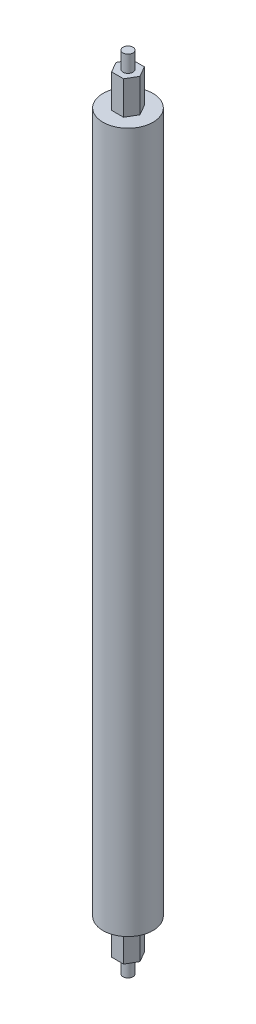
ISO-10303-21;
HEADER;
FILE_DESCRIPTION(('STEP AP214'),'2;1');
FILE_NAME('part.step','',(''),(''),'','','');
FILE_SCHEMA(('AUTOMOTIVE_DESIGN { 1 0 10303 214 1 1 1 1 }'));
ENDSEC;
DATA;
#1=APPLICATION_CONTEXT('core data for automotive mechanical design processes');
#2=APPLICATION_PROTOCOL_DEFINITION('international standard','automotive_design',2000,#1);
#3=PRODUCT_CONTEXT('',#1,'mechanical');
#4=PRODUCT('Part','Part','',(#3));
#5=PRODUCT_RELATED_PRODUCT_CATEGORY('part','',(#4));
#6=PRODUCT_DEFINITION_FORMATION('','',#4);
#7=PRODUCT_DEFINITION_CONTEXT('part definition',#1,'design');
#8=PRODUCT_DEFINITION('design','',#6,#7);
#9=PRODUCT_DEFINITION_SHAPE('','',#8);
#10=(LENGTH_UNIT() NAMED_UNIT(*) SI_UNIT(.MILLI.,.METRE.));
#11=(NAMED_UNIT(*) PLANE_ANGLE_UNIT() SI_UNIT($,.RADIAN.));
#12=(NAMED_UNIT(*) SI_UNIT($,.STERADIAN.) SOLID_ANGLE_UNIT());
#13=UNCERTAINTY_MEASURE_WITH_UNIT(LENGTH_MEASURE(1.E-05),#10,'distance_accuracy_value','');
#14=(GEOMETRIC_REPRESENTATION_CONTEXT(3) GLOBAL_UNCERTAINTY_ASSIGNED_CONTEXT((#13)) GLOBAL_UNIT_ASSIGNED_CONTEXT((#10,
#11,#12)) REPRESENTATION_CONTEXT('',''));
#15=CARTESIAN_POINT('',(0.,0.,0.));
#16=DIRECTION('',(0.,0.,1.));
#17=DIRECTION('',(1.,0.,0.));
#18=AXIS2_PLACEMENT_3D('',#15,#16,#17);
#19=CARTESIAN_POINT('',(0.,240.,0.));
#20=DIRECTION('',(0.,-1.,0.));
#21=DIRECTION('',(0.,0.,-1.));
#22=AXIS2_PLACEMENT_3D('',#19,#20,#21);
#23=CYLINDRICAL_SURFACE('',#22,7.5);
#24=CARTESIAN_POINT('',(0.,225.,0.));
#25=DIRECTION('',(0.,1.,0.));
#26=DIRECTION('',(0.,0.,1.));
#27=AXIS2_PLACEMENT_3D('',#24,#25,#26);
#28=CIRCLE('',#27,7.5);
#29=CARTESIAN_POINT('',(0.,225.,7.5));
#30=VERTEX_POINT('',#29);
#31=EDGE_CURVE('E53',#30,#30,#28,.T.);
#32=ORIENTED_EDGE('',*,*,#31,.F.);
#33=EDGE_LOOP('',(#32));
#34=FACE_BOUND('',#33,.T.);
#35=CARTESIAN_POINT('',(0.,15.,0.));
#36=DIRECTION('',(0.,1.,0.));
#37=DIRECTION('',(0.,0.,1.));
#38=AXIS2_PLACEMENT_3D('',#35,#36,#37);
#39=CIRCLE('',#38,7.5);
#40=CARTESIAN_POINT('',(0.,15.,7.5));
#41=VERTEX_POINT('',#40);
#42=EDGE_CURVE('E209',#41,#41,#39,.T.);
#43=ORIENTED_EDGE('',*,*,#42,.T.);
#44=EDGE_LOOP('',(#43));
#45=FACE_BOUND('',#44,.T.);
#46=ADVANCED_FACE('F45',(#34,#45),#23,.T.);
#47=CARTESIAN_POINT('',(0.,225.,0.));
#48=DIRECTION('',(0.,1.,0.));
#49=DIRECTION('',(0.,0.,1.));
#50=AXIS2_PLACEMENT_3D('',#47,#48,#49);
#51=PLANE('',#50);
#52=ORIENTED_EDGE('',*,*,#31,.T.);
#53=EDGE_LOOP('',(#52));
#54=FACE_BOUND('',#53,.T.);
#55=DIRECTION('',(0.499999999999997,0.,0.866025403784441));
#56=VECTOR('',#55,1.);
#57=CARTESIAN_POINT('',(-1.8,225.,3.11769145362398));
#58=LINE('',#57,#56);
#59=CARTESIAN_POINT('',(-3.59999999999999,225.,0.));
#60=VERTEX_POINT('',#59);
#61=CARTESIAN_POINT('',(-1.8,225.,3.11769145362398));
#62=VERTEX_POINT('',#61);
#63=EDGE_CURVE('E238',#60,#62,#58,.T.);
#64=ORIENTED_EDGE('',*,*,#63,.F.);
#65=DIRECTION('',(-0.499999999999998,0.,0.86602540378444));
#66=VECTOR('',#65,1.);
#67=CARTESIAN_POINT('',(-3.59999999999999,225.,0.));
#68=LINE('',#67,#66);
#69=CARTESIAN_POINT('',(-1.79999999999999,225.,-3.11769145362398));
#70=VERTEX_POINT('',#69);
#71=EDGE_CURVE('E213',#70,#60,#68,.T.);
#72=ORIENTED_EDGE('',*,*,#71,.F.);
#73=DIRECTION('',(-1.,0.,0.));
#74=VECTOR('',#73,1.);
#75=CARTESIAN_POINT('',(-1.79999999999999,225.,-3.11769145362398));
#76=LINE('',#75,#74);
#77=CARTESIAN_POINT('',(1.8,225.,-3.11769145362399));
#78=VERTEX_POINT('',#77);
#79=EDGE_CURVE('E219',#78,#70,#76,.T.);
#80=ORIENTED_EDGE('',*,*,#79,.F.);
#81=DIRECTION('',(-0.499999999999998,0.,-0.86602540378444));
#82=VECTOR('',#81,1.);
#83=CARTESIAN_POINT('',(1.8,225.,-3.11769145362399));
#84=LINE('',#83,#82);
#85=CARTESIAN_POINT('',(3.59999999999999,225.,0.));
#86=VERTEX_POINT('',#85);
#87=EDGE_CURVE('E247',#86,#78,#84,.T.);
#88=ORIENTED_EDGE('',*,*,#87,.F.);
#89=DIRECTION('',(0.499999999999998,0.,-0.86602540378444));
#90=VECTOR('',#89,1.);
#91=CARTESIAN_POINT('',(3.59999999999999,225.,0.));
#92=LINE('',#91,#90);
#93=CARTESIAN_POINT('',(1.8,225.,3.11769145362398));
#94=VERTEX_POINT('',#93);
#95=EDGE_CURVE('E244',#94,#86,#92,.T.);
#96=ORIENTED_EDGE('',*,*,#95,.F.);
#97=DIRECTION('',(1.,0.,0.));
#98=VECTOR('',#97,1.);
#99=CARTESIAN_POINT('',(1.8,225.,3.11769145362398));
#100=LINE('',#99,#98);
#101=EDGE_CURVE('E241',#62,#94,#100,.T.);
#102=ORIENTED_EDGE('',*,*,#101,.F.);
#103=EDGE_LOOP('',(#64,#72,#80,#88,#96,#102));
#104=FACE_BOUND('',#103,.T.);
#105=ADVANCED_FACE('F322',(#54,#104),#51,.T.);
#106=CARTESIAN_POINT('',(-3.59999999999999,235.,0.));
#107=DIRECTION('',(0.86602540378444,0.,0.499999999999998));
#108=DIRECTION('',(0.499999999999998,0.,-0.86602540378444));
#109=AXIS2_PLACEMENT_3D('',#106,#107,#108);
#110=PLANE('',#109);
#111=ORIENTED_EDGE('',*,*,#71,.T.);
#112=DIRECTION('',(0.,-1.,0.));
#113=VECTOR('',#112,1.);
#114=CARTESIAN_POINT('',(-3.59999999999999,235.,0.));
#115=LINE('',#114,#113);
#116=CARTESIAN_POINT('',(-3.59999999999999,235.,0.));
#117=VERTEX_POINT('',#116);
#118=EDGE_CURVE('E271',#117,#60,#115,.T.);
#119=ORIENTED_EDGE('',*,*,#118,.F.);
#120=DIRECTION('',(-0.499999999999998,0.,0.86602540378444));
#121=VECTOR('',#120,1.);
#122=CARTESIAN_POINT('',(-3.59999999999999,235.,0.));
#123=LINE('',#122,#121);
#124=CARTESIAN_POINT('',(-1.79999999999999,235.,-3.11769145362398));
#125=VERTEX_POINT('',#124);
#126=EDGE_CURVE('E214',#125,#117,#123,.T.);
#127=ORIENTED_EDGE('',*,*,#126,.F.);
#128=DIRECTION('',(0.,-1.,0.));
#129=VECTOR('',#128,1.);
#130=CARTESIAN_POINT('',(-1.79999999999999,235.,-3.11769145362398));
#131=LINE('',#130,#129);
#132=EDGE_CURVE('E234',#125,#70,#131,.T.);
#133=ORIENTED_EDGE('',*,*,#132,.T.);
#134=EDGE_LOOP('',(#111,#119,#127,#133));
#135=FACE_BOUND('',#134,.T.);
#136=ADVANCED_FACE('F299',(#135),#110,.F.);
#137=CARTESIAN_POINT('',(-1.8,235.,3.11769145362398));
#138=DIRECTION('',(0.866025403784441,0.,-0.499999999999997));
#139=DIRECTION('',(-0.499999999999997,0.,-0.866025403784441));
#140=AXIS2_PLACEMENT_3D('',#137,#138,#139);
#141=PLANE('',#140);
#142=ORIENTED_EDGE('',*,*,#63,.T.);
#143=DIRECTION('',(0.,-1.,0.));
#144=VECTOR('',#143,1.);
#145=CARTESIAN_POINT('',(-1.8,235.,3.11769145362398));
#146=LINE('',#145,#144);
#147=CARTESIAN_POINT('',(-1.8,235.,3.11769145362398));
#148=VERTEX_POINT('',#147);
#149=EDGE_CURVE('E267',#148,#62,#146,.T.);
#150=ORIENTED_EDGE('',*,*,#149,.F.);
#151=DIRECTION('',(0.499999999999997,0.,0.866025403784441));
#152=VECTOR('',#151,1.);
#153=CARTESIAN_POINT('',(-1.8,235.,3.11769145362398));
#154=LINE('',#153,#152);
#155=EDGE_CURVE('E218',#117,#148,#154,.T.);
#156=ORIENTED_EDGE('',*,*,#155,.F.);
#157=ORIENTED_EDGE('',*,*,#118,.T.);
#158=EDGE_LOOP('',(#142,#150,#156,#157));
#159=FACE_BOUND('',#158,.T.);
#160=ADVANCED_FACE('F303',(#159),#141,.F.);
#161=CARTESIAN_POINT('',(1.8,235.,3.11769145362398));
#162=DIRECTION('',(0.,0.,-1.));
#163=DIRECTION('',(-1.,0.,0.));
#164=AXIS2_PLACEMENT_3D('',#161,#162,#163);
#165=PLANE('',#164);
#166=ORIENTED_EDGE('',*,*,#101,.T.);
#167=DIRECTION('',(0.,-1.,0.));
#168=VECTOR('',#167,1.);
#169=CARTESIAN_POINT('',(1.8,235.,3.11769145362398));
#170=LINE('',#169,#168);
#171=CARTESIAN_POINT('',(1.8,235.,3.11769145362398));
#172=VERTEX_POINT('',#171);
#173=EDGE_CURVE('E263',#172,#94,#170,.T.);
#174=ORIENTED_EDGE('',*,*,#173,.F.);
#175=DIRECTION('',(1.,0.,0.));
#176=VECTOR('',#175,1.);
#177=CARTESIAN_POINT('',(1.8,235.,3.11769145362398));
#178=LINE('',#177,#176);
#179=EDGE_CURVE('E222',#148,#172,#178,.T.);
#180=ORIENTED_EDGE('',*,*,#179,.F.);
#181=ORIENTED_EDGE('',*,*,#149,.T.);
#182=EDGE_LOOP('',(#166,#174,#180,#181));
#183=FACE_BOUND('',#182,.T.);
#184=ADVANCED_FACE('F308',(#183),#165,.F.);
#185=CARTESIAN_POINT('',(3.59999999999999,235.,0.));
#186=DIRECTION('',(-0.86602540378444,0.,-0.499999999999998));
#187=DIRECTION('',(-0.499999999999998,0.,0.86602540378444));
#188=AXIS2_PLACEMENT_3D('',#185,#186,#187);
#189=PLANE('',#188);
#190=ORIENTED_EDGE('',*,*,#95,.T.);
#191=DIRECTION('',(0.,-1.,0.));
#192=VECTOR('',#191,1.);
#193=CARTESIAN_POINT('',(3.59999999999999,235.,0.));
#194=LINE('',#193,#192);
#195=CARTESIAN_POINT('',(3.59999999999999,235.,0.));
#196=VERTEX_POINT('',#195);
#197=EDGE_CURVE('E259',#196,#86,#194,.T.);
#198=ORIENTED_EDGE('',*,*,#197,.F.);
#199=DIRECTION('',(0.499999999999998,0.,-0.86602540378444));
#200=VECTOR('',#199,1.);
#201=CARTESIAN_POINT('',(3.59999999999999,235.,0.));
#202=LINE('',#201,#200);
#203=EDGE_CURVE('E225',#172,#196,#202,.T.);
#204=ORIENTED_EDGE('',*,*,#203,.F.);
#205=ORIENTED_EDGE('',*,*,#173,.T.);
#206=EDGE_LOOP('',(#190,#198,#204,#205));
#207=FACE_BOUND('',#206,.T.);
#208=ADVANCED_FACE('F314',(#207),#189,.F.);
#209=CARTESIAN_POINT('',(1.8,235.,-3.11769145362399));
#210=DIRECTION('',(-0.86602540378444,0.,0.499999999999998));
#211=DIRECTION('',(0.499999999999998,0.,0.86602540378444));
#212=AXIS2_PLACEMENT_3D('',#209,#210,#211);
#213=PLANE('',#212);
#214=ORIENTED_EDGE('',*,*,#87,.T.);
#215=DIRECTION('',(0.,-1.,0.));
#216=VECTOR('',#215,1.);
#217=CARTESIAN_POINT('',(1.8,235.,-3.11769145362399));
#218=LINE('',#217,#216);
#219=CARTESIAN_POINT('',(1.8,235.,-3.11769145362399));
#220=VERTEX_POINT('',#219);
#221=EDGE_CURVE('E256',#220,#78,#218,.T.);
#222=ORIENTED_EDGE('',*,*,#221,.F.);
#223=DIRECTION('',(-0.499999999999998,0.,-0.86602540378444));
#224=VECTOR('',#223,1.);
#225=CARTESIAN_POINT('',(1.8,235.,-3.11769145362399));
#226=LINE('',#225,#224);
#227=EDGE_CURVE('E228',#196,#220,#226,.T.);
#228=ORIENTED_EDGE('',*,*,#227,.F.);
#229=ORIENTED_EDGE('',*,*,#197,.T.);
#230=EDGE_LOOP('',(#214,#222,#228,#229));
#231=FACE_BOUND('',#230,.T.);
#232=ADVANCED_FACE('F318',(#231),#213,.F.);
#233=CARTESIAN_POINT('',(-1.79999999999999,235.,-3.11769145362398));
#234=DIRECTION('',(0.,0.,1.));
#235=DIRECTION('',(1.,0.,0.));
#236=AXIS2_PLACEMENT_3D('',#233,#234,#235);
#237=PLANE('',#236);
#238=ORIENTED_EDGE('',*,*,#79,.T.);
#239=ORIENTED_EDGE('',*,*,#132,.F.);
#240=DIRECTION('',(-1.,0.,0.));
#241=VECTOR('',#240,1.);
#242=CARTESIAN_POINT('',(-1.79999999999999,235.,-3.11769145362398));
#243=LINE('',#242,#241);
#244=EDGE_CURVE('E231',#220,#125,#243,.T.);
#245=ORIENTED_EDGE('',*,*,#244,.F.);
#246=ORIENTED_EDGE('',*,*,#221,.T.);
#247=EDGE_LOOP('',(#238,#239,#245,#246));
#248=FACE_BOUND('',#247,.T.);
#249=ADVANCED_FACE('F291',(#248),#237,.F.);
#250=CARTESIAN_POINT('',(0.,235.,0.));
#251=DIRECTION('',(0.,-1.,0.));
#252=DIRECTION('',(0.,0.,-1.));
#253=AXIS2_PLACEMENT_3D('',#250,#251,#252);
#254=PLANE('',#253);
#255=CARTESIAN_POINT('',(0.,235.,0.));
#256=DIRECTION('',(0.,-1.,0.));
#257=DIRECTION('',(0.,0.,-1.));
#258=AXIS2_PLACEMENT_3D('',#255,#256,#257);
#259=CIRCLE('',#258,1.5);
#260=CARTESIAN_POINT('',(0.,235.,-1.5));
#261=VERTEX_POINT('',#260);
#262=EDGE_CURVE('E274',#261,#261,#259,.F.);
#263=ORIENTED_EDGE('',*,*,#262,.F.);
#264=EDGE_LOOP('',(#263));
#265=FACE_BOUND('',#264,.T.);
#266=ORIENTED_EDGE('',*,*,#126,.T.);
#267=ORIENTED_EDGE('',*,*,#155,.T.);
#268=ORIENTED_EDGE('',*,*,#179,.T.);
#269=ORIENTED_EDGE('',*,*,#203,.T.);
#270=ORIENTED_EDGE('',*,*,#227,.T.);
#271=ORIENTED_EDGE('',*,*,#244,.T.);
#272=EDGE_LOOP('',(#266,#267,#268,#269,#270,#271));
#273=FACE_BOUND('',#272,.T.);
#274=ADVANCED_FACE('F287',(#265,#273),#254,.F.);
#275=CARTESIAN_POINT('',(0.,240.,0.));
#276=DIRECTION('',(0.,1.,0.));
#277=DIRECTION('',(0.,0.,1.));
#278=AXIS2_PLACEMENT_3D('',#275,#276,#277);
#279=PLANE('',#278);
#280=CARTESIAN_POINT('',(0.,240.,0.));
#281=DIRECTION('',(0.,1.,0.));
#282=DIRECTION('',(0.,0.,1.));
#283=AXIS2_PLACEMENT_3D('',#280,#281,#282);
#284=CIRCLE('',#283,1.5);
#285=CARTESIAN_POINT('',(0.,240.,1.5));
#286=VERTEX_POINT('',#285);
#287=EDGE_CURVE('E275',#286,#286,#284,.T.);
#288=ORIENTED_EDGE('',*,*,#287,.T.);
#289=EDGE_LOOP('',(#288));
#290=FACE_BOUND('',#289,.T.);
#291=ADVANCED_FACE('F290',(#290),#279,.T.);
#292=CARTESIAN_POINT('',(0.,225.,0.));
#293=DIRECTION('',(0.,1.,0.));
#294=DIRECTION('',(0.,0.,1.));
#295=AXIS2_PLACEMENT_3D('',#292,#293,#294);
#296=CYLINDRICAL_SURFACE('',#295,1.5);
#297=ORIENTED_EDGE('',*,*,#287,.F.);
#298=EDGE_LOOP('',(#297));
#299=FACE_BOUND('',#298,.T.);
#300=ORIENTED_EDGE('',*,*,#262,.T.);
#301=EDGE_LOOP('',(#300));
#302=FACE_BOUND('',#301,.T.);
#303=ADVANCED_FACE('F285',(#299,#302),#296,.T.);
#304=CARTESIAN_POINT('',(0.,15.,0.));
#305=DIRECTION('',(0.,-1.,0.));
#306=DIRECTION('',(0.,0.,1.));
#307=AXIS2_PLACEMENT_3D('',#304,#305,#306);
#308=PLANE('',#307);
#309=DIRECTION('',(-0.499999999999998,0.,0.86602540378444));
#310=VECTOR('',#309,1.);
#311=CARTESIAN_POINT('',(-3.59999999999999,15.,0.));
#312=LINE('',#311,#310);
#313=CARTESIAN_POINT('',(-1.79999999999999,15.,-3.11769145362398));
#314=VERTEX_POINT('',#313);
#315=CARTESIAN_POINT('',(-3.59999999999999,15.,0.));
#316=VERTEX_POINT('',#315);
#317=EDGE_CURVE('E139',#314,#316,#312,.T.);
#318=ORIENTED_EDGE('',*,*,#317,.T.);
#319=DIRECTION('',(0.499999999999997,0.,0.866025403784441));
#320=VECTOR('',#319,1.);
#321=CARTESIAN_POINT('',(-1.8,15.,3.11769145362398));
#322=LINE('',#321,#320);
#323=CARTESIAN_POINT('',(-1.8,15.,3.11769145362398));
#324=VERTEX_POINT('',#323);
#325=EDGE_CURVE('E156',#316,#324,#322,.T.);
#326=ORIENTED_EDGE('',*,*,#325,.T.);
#327=DIRECTION('',(1.,0.,0.));
#328=VECTOR('',#327,1.);
#329=CARTESIAN_POINT('',(1.8,15.,3.11769145362398));
#330=LINE('',#329,#328);
#331=CARTESIAN_POINT('',(1.8,15.,3.11769145362398));
#332=VERTEX_POINT('',#331);
#333=EDGE_CURVE('E185',#324,#332,#330,.T.);
#334=ORIENTED_EDGE('',*,*,#333,.T.);
#335=DIRECTION('',(0.499999999999998,0.,-0.86602540378444));
#336=VECTOR('',#335,1.);
#337=CARTESIAN_POINT('',(3.59999999999999,15.,0.));
#338=LINE('',#337,#336);
#339=CARTESIAN_POINT('',(3.59999999999999,15.,0.));
#340=VERTEX_POINT('',#339);
#341=EDGE_CURVE('E182',#332,#340,#338,.T.);
#342=ORIENTED_EDGE('',*,*,#341,.T.);
#343=DIRECTION('',(-0.499999999999998,0.,-0.86602540378444));
#344=VECTOR('',#343,1.);
#345=CARTESIAN_POINT('',(1.8,15.,-3.11769145362399));
#346=LINE('',#345,#344);
#347=CARTESIAN_POINT('',(1.8,15.,-3.11769145362399));
#348=VERTEX_POINT('',#347);
#349=EDGE_CURVE('E65',#340,#348,#346,.T.);
#350=ORIENTED_EDGE('',*,*,#349,.T.);
#351=DIRECTION('',(-1.,0.,0.));
#352=VECTOR('',#351,1.);
#353=CARTESIAN_POINT('',(-1.79999999999999,15.,-3.11769145362398));
#354=LINE('',#353,#352);
#355=EDGE_CURVE('E60',#348,#314,#354,.T.);
#356=ORIENTED_EDGE('',*,*,#355,.T.);
#357=EDGE_LOOP('',(#318,#326,#334,#342,#350,#356));
#358=FACE_BOUND('',#357,.T.);
#359=ORIENTED_EDGE('',*,*,#42,.F.);
#360=EDGE_LOOP('',(#359));
#361=FACE_BOUND('',#360,.T.);
#362=ADVANCED_FACE('F373',(#358,#361),#308,.T.);
#363=CARTESIAN_POINT('',(-3.59999999999999,5.00000000000001,0.));
#364=DIRECTION('',(-0.86602540378444,0.,-0.499999999999998));
#365=DIRECTION('',(-0.499999999999998,0.,0.86602540378444));
#366=AXIS2_PLACEMENT_3D('',#363,#364,#365);
#367=PLANE('',#366);
#368=ORIENTED_EDGE('',*,*,#317,.F.);
#369=DIRECTION('',(0.,1.,0.));
#370=VECTOR('',#369,1.);
#371=CARTESIAN_POINT('',(-1.79999999999999,5.00000000000001,-3.11769145362398));
#372=LINE('',#371,#370);
#373=CARTESIAN_POINT('',(-1.79999999999999,5.00000000000001,-3.11769145362398));
#374=VERTEX_POINT('',#373);
#375=EDGE_CURVE('E133',#374,#314,#372,.T.);
#376=ORIENTED_EDGE('',*,*,#375,.F.);
#377=DIRECTION('',(-0.499999999999998,0.,0.86602540378444));
#378=VECTOR('',#377,1.);
#379=CARTESIAN_POINT('',(-3.59999999999999,5.00000000000001,0.));
#380=LINE('',#379,#378);
#381=CARTESIAN_POINT('',(-3.59999999999999,5.00000000000001,0.));
#382=VERTEX_POINT('',#381);
#383=EDGE_CURVE('E137',#374,#382,#380,.T.);
#384=ORIENTED_EDGE('',*,*,#383,.T.);
#385=DIRECTION('',(0.,1.,0.));
#386=VECTOR('',#385,1.);
#387=CARTESIAN_POINT('',(-3.59999999999999,5.00000000000001,0.));
#388=LINE('',#387,#386);
#389=EDGE_CURVE('E175',#382,#316,#388,.T.);
#390=ORIENTED_EDGE('',*,*,#389,.T.);
#391=EDGE_LOOP('',(#368,#376,#384,#390));
#392=FACE_BOUND('',#391,.T.);
#393=ADVANCED_FACE('F135',(#392),#367,.T.);
#394=CARTESIAN_POINT('',(-1.79999999999999,5.00000000000001,-3.11769145362398));
#395=DIRECTION('',(0.,0.,-1.));
#396=DIRECTION('',(-1.,0.,0.));
#397=AXIS2_PLACEMENT_3D('',#394,#395,#396);
#398=PLANE('',#397);
#399=ORIENTED_EDGE('',*,*,#355,.F.);
#400=DIRECTION('',(0.,1.,0.));
#401=VECTOR('',#400,1.);
#402=CARTESIAN_POINT('',(1.8,5.00000000000001,-3.11769145362399));
#403=LINE('',#402,#401);
#404=CARTESIAN_POINT('',(1.8,5.00000000000001,-3.11769145362399));
#405=VERTEX_POINT('',#404);
#406=EDGE_CURVE('E144',#405,#348,#403,.T.);
#407=ORIENTED_EDGE('',*,*,#406,.F.);
#408=DIRECTION('',(-1.,0.,0.));
#409=VECTOR('',#408,1.);
#410=CARTESIAN_POINT('',(-1.79999999999999,5.00000000000001,-3.11769145362398));
#411=LINE('',#410,#409);
#412=EDGE_CURVE('E150',#405,#374,#411,.T.);
#413=ORIENTED_EDGE('',*,*,#412,.T.);
#414=ORIENTED_EDGE('',*,*,#375,.T.);
#415=EDGE_LOOP('',(#399,#407,#413,#414));
#416=FACE_BOUND('',#415,.T.);
#417=ADVANCED_FACE('F158',(#416),#398,.T.);
#418=CARTESIAN_POINT('',(1.8,5.00000000000001,-3.11769145362399));
#419=DIRECTION('',(0.86602540378444,0.,-0.499999999999998));
#420=DIRECTION('',(-0.499999999999998,0.,-0.86602540378444));
#421=AXIS2_PLACEMENT_3D('',#418,#419,#420);
#422=PLANE('',#421);
#423=ORIENTED_EDGE('',*,*,#349,.F.);
#424=DIRECTION('',(0.,1.,0.));
#425=VECTOR('',#424,1.);
#426=CARTESIAN_POINT('',(3.59999999999999,5.00000000000001,0.));
#427=LINE('',#426,#425);
#428=CARTESIAN_POINT('',(3.59999999999999,5.00000000000001,0.));
#429=VERTEX_POINT('',#428);
#430=EDGE_CURVE('E200',#429,#340,#427,.T.);
#431=ORIENTED_EDGE('',*,*,#430,.F.);
#432=DIRECTION('',(-0.499999999999998,0.,-0.86602540378444));
#433=VECTOR('',#432,1.);
#434=CARTESIAN_POINT('',(1.8,5.00000000000001,-3.11769145362399));
#435=LINE('',#434,#433);
#436=EDGE_CURVE('E160',#429,#405,#435,.T.);
#437=ORIENTED_EDGE('',*,*,#436,.T.);
#438=ORIENTED_EDGE('',*,*,#406,.T.);
#439=EDGE_LOOP('',(#423,#431,#437,#438));
#440=FACE_BOUND('',#439,.T.);
#441=ADVANCED_FACE('F365',(#440),#422,.T.);
#442=CARTESIAN_POINT('',(3.59999999999999,5.00000000000001,0.));
#443=DIRECTION('',(0.86602540378444,0.,0.499999999999998));
#444=DIRECTION('',(0.499999999999998,0.,-0.86602540378444));
#445=AXIS2_PLACEMENT_3D('',#442,#443,#444);
#446=PLANE('',#445);
#447=ORIENTED_EDGE('',*,*,#341,.F.);
#448=DIRECTION('',(0.,1.,0.));
#449=VECTOR('',#448,1.);
#450=CARTESIAN_POINT('',(1.8,5.00000000000001,3.11769145362398));
#451=LINE('',#450,#449);
#452=CARTESIAN_POINT('',(1.8,5.00000000000001,3.11769145362398));
#453=VERTEX_POINT('',#452);
#454=EDGE_CURVE('E196',#453,#332,#451,.T.);
#455=ORIENTED_EDGE('',*,*,#454,.F.);
#456=DIRECTION('',(0.499999999999998,0.,-0.86602540378444));
#457=VECTOR('',#456,1.);
#458=CARTESIAN_POINT('',(3.59999999999999,5.00000000000001,0.));
#459=LINE('',#458,#457);
#460=EDGE_CURVE('E163',#453,#429,#459,.T.);
#461=ORIENTED_EDGE('',*,*,#460,.T.);
#462=ORIENTED_EDGE('',*,*,#430,.T.);
#463=EDGE_LOOP('',(#447,#455,#461,#462));
#464=FACE_BOUND('',#463,.T.);
#465=ADVANCED_FACE('F361',(#464),#446,.T.);
#466=CARTESIAN_POINT('',(1.8,5.00000000000001,3.11769145362398));
#467=DIRECTION('',(0.,0.,1.));
#468=DIRECTION('',(1.,0.,0.));
#469=AXIS2_PLACEMENT_3D('',#466,#467,#468);
#470=PLANE('',#469);
#471=ORIENTED_EDGE('',*,*,#333,.F.);
#472=DIRECTION('',(0.,1.,0.));
#473=VECTOR('',#472,1.);
#474=CARTESIAN_POINT('',(-1.8,5.00000000000001,3.11769145362398));
#475=LINE('',#474,#473);
#476=CARTESIAN_POINT('',(-1.8,5.00000000000001,3.11769145362398));
#477=VERTEX_POINT('',#476);
#478=EDGE_CURVE('E192',#477,#324,#475,.T.);
#479=ORIENTED_EDGE('',*,*,#478,.F.);
#480=DIRECTION('',(1.,0.,0.));
#481=VECTOR('',#480,1.);
#482=CARTESIAN_POINT('',(1.8,5.00000000000001,3.11769145362398));
#483=LINE('',#482,#481);
#484=EDGE_CURVE('E169',#477,#453,#483,.T.);
#485=ORIENTED_EDGE('',*,*,#484,.T.);
#486=ORIENTED_EDGE('',*,*,#454,.T.);
#487=EDGE_LOOP('',(#471,#479,#485,#486));
#488=FACE_BOUND('',#487,.T.);
#489=ADVANCED_FACE('F355',(#488),#470,.T.);
#490=CARTESIAN_POINT('',(-1.8,5.00000000000001,3.11769145362398));
#491=DIRECTION('',(-0.866025403784441,0.,0.499999999999997));
#492=DIRECTION('',(0.499999999999997,0.,0.866025403784441));
#493=AXIS2_PLACEMENT_3D('',#490,#491,#492);
#494=PLANE('',#493);
#495=ORIENTED_EDGE('',*,*,#325,.F.);
#496=ORIENTED_EDGE('',*,*,#389,.F.);
#497=DIRECTION('',(0.499999999999997,0.,0.866025403784441));
#498=VECTOR('',#497,1.);
#499=CARTESIAN_POINT('',(-1.8,5.00000000000001,3.11769145362398));
#500=LINE('',#499,#498);
#501=EDGE_CURVE('E154',#382,#477,#500,.T.);
#502=ORIENTED_EDGE('',*,*,#501,.T.);
#503=ORIENTED_EDGE('',*,*,#478,.T.);
#504=EDGE_LOOP('',(#495,#496,#502,#503));
#505=FACE_BOUND('',#504,.T.);
#506=ADVANCED_FACE('F346',(#505),#494,.T.);
#507=CARTESIAN_POINT('',(0.,5.00000000000001,0.));
#508=DIRECTION('',(0.,1.,0.));
#509=DIRECTION('',(0.,0.,-1.));
#510=AXIS2_PLACEMENT_3D('',#507,#508,#509);
#511=PLANE('',#510);
#512=CARTESIAN_POINT('',(0.,5.00000000000001,0.));
#513=DIRECTION('',(0.,1.,0.));
#514=DIRECTION('',(0.,0.,1.));
#515=AXIS2_PLACEMENT_3D('',#512,#513,#514);
#516=CIRCLE('',#515,1.5);
#517=CARTESIAN_POINT('',(0.,5.00000000000001,1.5));
#518=VERTEX_POINT('',#517);
#519=EDGE_CURVE('E11',#518,#518,#516,.T.);
#520=ORIENTED_EDGE('',*,*,#519,.T.);
#521=EDGE_LOOP('',(#520));
#522=FACE_BOUND('',#521,.T.);
#523=ORIENTED_EDGE('',*,*,#383,.F.);
#524=ORIENTED_EDGE('',*,*,#412,.F.);
#525=ORIENTED_EDGE('',*,*,#436,.F.);
#526=ORIENTED_EDGE('',*,*,#460,.F.);
#527=ORIENTED_EDGE('',*,*,#484,.F.);
#528=ORIENTED_EDGE('',*,*,#501,.F.);
#529=EDGE_LOOP('',(#523,#524,#525,#526,#527,#528));
#530=FACE_BOUND('',#529,.T.);
#531=ADVANCED_FACE('F148',(#522,#530),#511,.F.);
#532=CARTESIAN_POINT('',(0.,0.,0.));
#533=DIRECTION('',(0.,1.,0.));
#534=DIRECTION('',(0.,0.,1.));
#535=AXIS2_PLACEMENT_3D('',#532,#533,#534);
#536=PLANE('',#535);
#537=CARTESIAN_POINT('',(0.,0.,0.));
#538=DIRECTION('',(0.,1.,0.));
#539=DIRECTION('',(0.,0.,1.));
#540=AXIS2_PLACEMENT_3D('',#537,#538,#539);
#541=CIRCLE('',#540,1.5);
#542=CARTESIAN_POINT('',(0.,0.,1.5));
#543=VERTEX_POINT('',#542);
#544=EDGE_CURVE('E143',#543,#543,#541,.T.);
#545=ORIENTED_EDGE('',*,*,#544,.F.);
#546=EDGE_LOOP('',(#545));
#547=FACE_BOUND('',#546,.T.);
#548=ADVANCED_FACE('F336',(#547),#536,.F.);
#549=CARTESIAN_POINT('',(0.,15.,0.));
#550=DIRECTION('',(0.,-1.,0.));
#551=DIRECTION('',(0.,0.,-1.));
#552=AXIS2_PLACEMENT_3D('',#549,#550,#551);
#553=CYLINDRICAL_SURFACE('',#552,1.5);
#554=ORIENTED_EDGE('',*,*,#544,.T.);
#555=EDGE_LOOP('',(#554));
#556=FACE_BOUND('',#555,.T.);
#557=ORIENTED_EDGE('',*,*,#519,.F.);
#558=EDGE_LOOP('',(#557));
#559=FACE_BOUND('',#558,.T.);
#560=ADVANCED_FACE('F338',(#556,#559),#553,.T.);
#561=CLOSED_SHELL('',(#46,#105,#136,#160,#184,#208,#232,#249,#274,#291,#303,#362,#393,#417,#441,
#465,#489,#506,#531,#548,#560));
#562=MANIFOLD_SOLID_BREP('B2',#561);
#563=ADVANCED_BREP_SHAPE_REPRESENTATION('',(#18,#562),#14);
#564=SHAPE_DEFINITION_REPRESENTATION(#9,#563);
ENDSEC;
END-ISO-10303-21;
